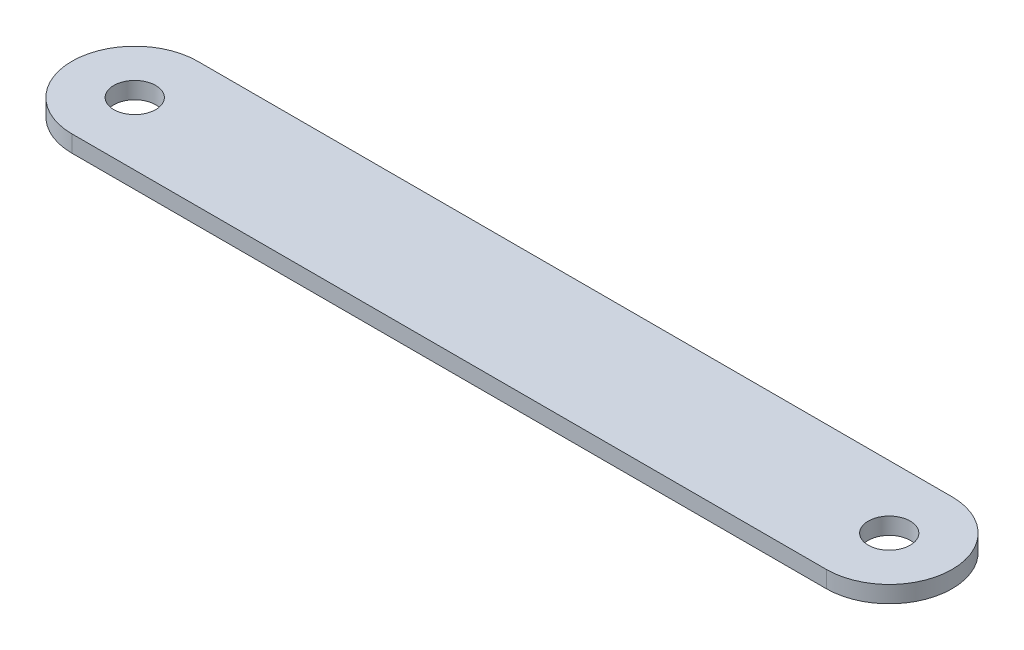
ISO-10303-21;
HEADER;
FILE_DESCRIPTION(('STEP AP214'),'2;1');
FILE_NAME('part.step','',(''),(''),'','','');
FILE_SCHEMA(('AUTOMOTIVE_DESIGN { 1 0 10303 214 1 1 1 1 }'));
ENDSEC;
DATA;
#1=APPLICATION_CONTEXT('core data for automotive mechanical design processes');
#2=APPLICATION_PROTOCOL_DEFINITION('international standard','automotive_design',2000,#1);
#3=PRODUCT_CONTEXT('',#1,'mechanical');
#4=PRODUCT('Part','Part','',(#3));
#5=PRODUCT_RELATED_PRODUCT_CATEGORY('part','',(#4));
#6=PRODUCT_DEFINITION_FORMATION('','',#4);
#7=PRODUCT_DEFINITION_CONTEXT('part definition',#1,'design');
#8=PRODUCT_DEFINITION('design','',#6,#7);
#9=PRODUCT_DEFINITION_SHAPE('','',#8);
#10=(LENGTH_UNIT() NAMED_UNIT(*) SI_UNIT(.MILLI.,.METRE.));
#11=(NAMED_UNIT(*) PLANE_ANGLE_UNIT() SI_UNIT($,.RADIAN.));
#12=(NAMED_UNIT(*) SI_UNIT($,.STERADIAN.) SOLID_ANGLE_UNIT());
#13=UNCERTAINTY_MEASURE_WITH_UNIT(LENGTH_MEASURE(1.E-05),#10,'distance_accuracy_value','');
#14=(GEOMETRIC_REPRESENTATION_CONTEXT(3) GLOBAL_UNCERTAINTY_ASSIGNED_CONTEXT((#13)) GLOBAL_UNIT_ASSIGNED_CONTEXT((#10,
#11,#12)) REPRESENTATION_CONTEXT('',''));
#15=CARTESIAN_POINT('',(0.,0.,0.));
#16=DIRECTION('',(0.,0.,1.));
#17=DIRECTION('',(1.,0.,0.));
#18=AXIS2_PLACEMENT_3D('',#15,#16,#17);
#19=CARTESIAN_POINT('',(0.,4.,0.));
#20=DIRECTION('',(0.,-1.,0.));
#21=DIRECTION('',(0.,0.,-1.));
#22=AXIS2_PLACEMENT_3D('',#19,#20,#21);
#23=CYLINDRICAL_SURFACE('',#22,15.);
#24=CARTESIAN_POINT('',(0.,0.,0.));
#25=DIRECTION('',(0.,1.,0.));
#26=DIRECTION('',(0.,0.,1.));
#27=AXIS2_PLACEMENT_3D('',#24,#25,#26);
#28=CIRCLE('',#27,15.);
#29=CARTESIAN_POINT('',(0.,0.,15.));
#30=VERTEX_POINT('',#29);
#31=CARTESIAN_POINT('',(0.,0.,-15.));
#32=VERTEX_POINT('',#31);
#33=EDGE_CURVE('E102',#30,#32,#28,.T.);
#34=ORIENTED_EDGE('',*,*,#33,.T.);
#35=DIRECTION('',(0.,-1.,0.));
#36=VECTOR('',#35,1.);
#37=CARTESIAN_POINT('',(0.,4.,-15.));
#38=LINE('',#37,#36);
#39=CARTESIAN_POINT('',(0.,4.,-15.));
#40=VERTEX_POINT('',#39);
#41=EDGE_CURVE('E11',#40,#32,#38,.T.);
#42=ORIENTED_EDGE('',*,*,#41,.F.);
#43=CARTESIAN_POINT('',(0.,4.,0.));
#44=DIRECTION('',(0.,1.,0.));
#45=DIRECTION('',(0.,0.,1.));
#46=AXIS2_PLACEMENT_3D('',#43,#44,#45);
#47=CIRCLE('',#46,15.);
#48=CARTESIAN_POINT('',(0.,4.,15.));
#49=VERTEX_POINT('',#48);
#50=EDGE_CURVE('E95',#49,#40,#47,.T.);
#51=ORIENTED_EDGE('',*,*,#50,.F.);
#52=DIRECTION('',(0.,-1.,0.));
#53=VECTOR('',#52,1.);
#54=CARTESIAN_POINT('',(0.,4.,15.));
#55=LINE('',#54,#53);
#56=EDGE_CURVE('E99',#49,#30,#55,.T.);
#57=ORIENTED_EDGE('',*,*,#56,.T.);
#58=EDGE_LOOP('',(#34,#42,#51,#57));
#59=FACE_BOUND('',#58,.T.);
#60=ADVANCED_FACE('F41',(#59),#23,.T.);
#61=CARTESIAN_POINT('',(0.,4.,-15.));
#62=DIRECTION('',(0.,0.,1.));
#63=DIRECTION('',(1.,0.,0.));
#64=AXIS2_PLACEMENT_3D('',#61,#62,#63);
#65=PLANE('',#64);
#66=DIRECTION('',(-1.,0.,0.));
#67=VECTOR('',#66,1.);
#68=CARTESIAN_POINT('',(0.,0.,-15.));
#69=LINE('',#68,#67);
#70=CARTESIAN_POINT('',(-180.,0.,-15.));
#71=VERTEX_POINT('',#70);
#72=EDGE_CURVE('E96',#32,#71,#69,.T.);
#73=ORIENTED_EDGE('',*,*,#72,.T.);
#74=DIRECTION('',(0.,-1.,0.));
#75=VECTOR('',#74,1.);
#76=CARTESIAN_POINT('',(-180.,4.,-15.));
#77=LINE('',#76,#75);
#78=CARTESIAN_POINT('',(-180.,4.,-15.));
#79=VERTEX_POINT('',#78);
#80=EDGE_CURVE('E47',#79,#71,#77,.T.);
#81=ORIENTED_EDGE('',*,*,#80,.F.);
#82=DIRECTION('',(-1.,0.,0.));
#83=VECTOR('',#82,1.);
#84=CARTESIAN_POINT('',(0.,4.,-15.));
#85=LINE('',#84,#83);
#86=EDGE_CURVE('E87',#40,#79,#85,.T.);
#87=ORIENTED_EDGE('',*,*,#86,.F.);
#88=ORIENTED_EDGE('',*,*,#41,.T.);
#89=EDGE_LOOP('',(#73,#81,#87,#88));
#90=FACE_BOUND('',#89,.T.);
#91=ADVANCED_FACE('F92',(#90),#65,.F.);
#92=CARTESIAN_POINT('',(-180.,4.,0.));
#93=DIRECTION('',(0.,-1.,0.));
#94=DIRECTION('',(0.,0.,-1.));
#95=AXIS2_PLACEMENT_3D('',#92,#93,#94);
#96=CYLINDRICAL_SURFACE('',#95,15.);
#97=CARTESIAN_POINT('',(-180.,0.,0.));
#98=DIRECTION('',(0.,1.,0.));
#99=DIRECTION('',(0.,0.,1.));
#100=AXIS2_PLACEMENT_3D('',#97,#98,#99);
#101=CIRCLE('',#100,15.);
#102=CARTESIAN_POINT('',(-180.,0.,15.));
#103=VERTEX_POINT('',#102);
#104=EDGE_CURVE('E74',#71,#103,#101,.T.);
#105=ORIENTED_EDGE('',*,*,#104,.T.);
#106=DIRECTION('',(0.,-1.,0.));
#107=VECTOR('',#106,1.);
#108=CARTESIAN_POINT('',(-180.,4.,15.));
#109=LINE('',#108,#107);
#110=CARTESIAN_POINT('',(-180.,4.,15.));
#111=VERTEX_POINT('',#110);
#112=EDGE_CURVE('E100',#111,#103,#109,.T.);
#113=ORIENTED_EDGE('',*,*,#112,.F.);
#114=CARTESIAN_POINT('',(-180.,4.,0.));
#115=DIRECTION('',(0.,1.,0.));
#116=DIRECTION('',(0.,0.,1.));
#117=AXIS2_PLACEMENT_3D('',#114,#115,#116);
#118=CIRCLE('',#117,15.);
#119=EDGE_CURVE('E89',#79,#111,#118,.T.);
#120=ORIENTED_EDGE('',*,*,#119,.F.);
#121=ORIENTED_EDGE('',*,*,#80,.T.);
#122=EDGE_LOOP('',(#105,#113,#120,#121));
#123=FACE_BOUND('',#122,.T.);
#124=ADVANCED_FACE('F98',(#123),#96,.T.);
#125=CARTESIAN_POINT('',(0.,4.,15.));
#126=DIRECTION('',(0.,0.,-1.));
#127=DIRECTION('',(-1.,0.,0.));
#128=AXIS2_PLACEMENT_3D('',#125,#126,#127);
#129=PLANE('',#128);
#130=DIRECTION('',(1.,0.,0.));
#131=VECTOR('',#130,1.);
#132=CARTESIAN_POINT('',(0.,0.,15.));
#133=LINE('',#132,#131);
#134=EDGE_CURVE('E76',#103,#30,#133,.T.);
#135=ORIENTED_EDGE('',*,*,#134,.T.);
#136=ORIENTED_EDGE('',*,*,#56,.F.);
#137=DIRECTION('',(1.,0.,0.));
#138=VECTOR('',#137,1.);
#139=CARTESIAN_POINT('',(0.,4.,15.));
#140=LINE('',#139,#138);
#141=EDGE_CURVE('E60',#111,#49,#140,.T.);
#142=ORIENTED_EDGE('',*,*,#141,.F.);
#143=ORIENTED_EDGE('',*,*,#112,.T.);
#144=EDGE_LOOP('',(#135,#136,#142,#143));
#145=FACE_BOUND('',#144,.T.);
#146=ADVANCED_FACE('F115',(#145),#129,.F.);
#147=CARTESIAN_POINT('',(0.,4.,0.));
#148=DIRECTION('',(0.,1.,0.));
#149=DIRECTION('',(0.,0.,1.));
#150=AXIS2_PLACEMENT_3D('',#147,#148,#149);
#151=PLANE('',#150);
#152=CARTESIAN_POINT('',(0.,4.,0.));
#153=DIRECTION('',(0.,1.,0.));
#154=DIRECTION('',(0.,0.,1.));
#155=AXIS2_PLACEMENT_3D('',#152,#153,#154);
#156=CIRCLE('',#155,5.);
#157=CARTESIAN_POINT('',(0.,4.,5.));
#158=VERTEX_POINT('',#157);
#159=EDGE_CURVE('E123',#158,#158,#156,.T.);
#160=ORIENTED_EDGE('',*,*,#159,.F.);
#161=EDGE_LOOP('',(#160));
#162=FACE_BOUND('',#161,.T.);
#163=CARTESIAN_POINT('',(-180.,4.,0.));
#164=DIRECTION('',(0.,1.,0.));
#165=DIRECTION('',(0.,0.,1.));
#166=AXIS2_PLACEMENT_3D('',#163,#164,#165);
#167=CIRCLE('',#166,4.99999999999999);
#168=CARTESIAN_POINT('',(-180.,4.,5.00000000000001));
#169=VERTEX_POINT('',#168);
#170=EDGE_CURVE('E124',#169,#169,#167,.T.);
#171=ORIENTED_EDGE('',*,*,#170,.F.);
#172=EDGE_LOOP('',(#171));
#173=FACE_BOUND('',#172,.T.);
#174=ORIENTED_EDGE('',*,*,#50,.T.);
#175=ORIENTED_EDGE('',*,*,#86,.T.);
#176=ORIENTED_EDGE('',*,*,#119,.T.);
#177=ORIENTED_EDGE('',*,*,#141,.T.);
#178=EDGE_LOOP('',(#174,#175,#176,#177));
#179=FACE_BOUND('',#178,.T.);
#180=ADVANCED_FACE('F86',(#162,#173,#179),#151,.T.);
#181=CARTESIAN_POINT('',(0.,0.,0.));
#182=DIRECTION('',(0.,1.,0.));
#183=DIRECTION('',(0.,0.,1.));
#184=AXIS2_PLACEMENT_3D('',#181,#182,#183);
#185=PLANE('',#184);
#186=CARTESIAN_POINT('',(0.,0.,0.));
#187=DIRECTION('',(0.,1.,0.));
#188=DIRECTION('',(0.,0.,1.));
#189=AXIS2_PLACEMENT_3D('',#186,#187,#188);
#190=CIRCLE('',#189,5.);
#191=CARTESIAN_POINT('',(0.,0.,5.));
#192=VERTEX_POINT('',#191);
#193=EDGE_CURVE('E110',#192,#192,#190,.T.);
#194=ORIENTED_EDGE('',*,*,#193,.T.);
#195=EDGE_LOOP('',(#194));
#196=FACE_BOUND('',#195,.T.);
#197=CARTESIAN_POINT('',(-180.,0.,0.));
#198=DIRECTION('',(0.,1.,0.));
#199=DIRECTION('',(0.,0.,1.));
#200=AXIS2_PLACEMENT_3D('',#197,#198,#199);
#201=CIRCLE('',#200,4.99999999999999);
#202=CARTESIAN_POINT('',(-180.,0.,5.00000000000001));
#203=VERTEX_POINT('',#202);
#204=EDGE_CURVE('E118',#203,#203,#201,.T.);
#205=ORIENTED_EDGE('',*,*,#204,.T.);
#206=EDGE_LOOP('',(#205));
#207=FACE_BOUND('',#206,.T.);
#208=ORIENTED_EDGE('',*,*,#33,.F.);
#209=ORIENTED_EDGE('',*,*,#134,.F.);
#210=ORIENTED_EDGE('',*,*,#104,.F.);
#211=ORIENTED_EDGE('',*,*,#72,.F.);
#212=EDGE_LOOP('',(#208,#209,#210,#211));
#213=FACE_BOUND('',#212,.T.);
#214=ADVANCED_FACE('F113',(#196,#207,#213),#185,.F.);
#215=CARTESIAN_POINT('',(-180.,0.,0.));
#216=DIRECTION('',(0.,1.,0.));
#217=DIRECTION('',(0.,0.,1.));
#218=AXIS2_PLACEMENT_3D('',#215,#216,#217);
#219=CYLINDRICAL_SURFACE('',#218,4.99999999999999);
#220=ORIENTED_EDGE('',*,*,#204,.F.);
#221=EDGE_LOOP('',(#220));
#222=FACE_BOUND('',#221,.T.);
#223=ORIENTED_EDGE('',*,*,#170,.T.);
#224=EDGE_LOOP('',(#223));
#225=FACE_BOUND('',#224,.T.);
#226=ADVANCED_FACE('F131',(#222,#225),#219,.F.);
#227=CARTESIAN_POINT('',(0.,0.,0.));
#228=DIRECTION('',(0.,1.,0.));
#229=DIRECTION('',(0.,0.,1.));
#230=AXIS2_PLACEMENT_3D('',#227,#228,#229);
#231=CYLINDRICAL_SURFACE('',#230,5.);
#232=ORIENTED_EDGE('',*,*,#193,.F.);
#233=EDGE_LOOP('',(#232));
#234=FACE_BOUND('',#233,.T.);
#235=ORIENTED_EDGE('',*,*,#159,.T.);
#236=EDGE_LOOP('',(#235));
#237=FACE_BOUND('',#236,.T.);
#238=ADVANCED_FACE('F135',(#234,#237),#231,.F.);
#239=CLOSED_SHELL('',(#60,#91,#124,#146,#180,#214,#226,#238));
#240=MANIFOLD_SOLID_BREP('B2',#239);
#241=ADVANCED_BREP_SHAPE_REPRESENTATION('',(#18,#240),#14);
#242=SHAPE_DEFINITION_REPRESENTATION(#9,#241);
ENDSEC;
END-ISO-10303-21;
